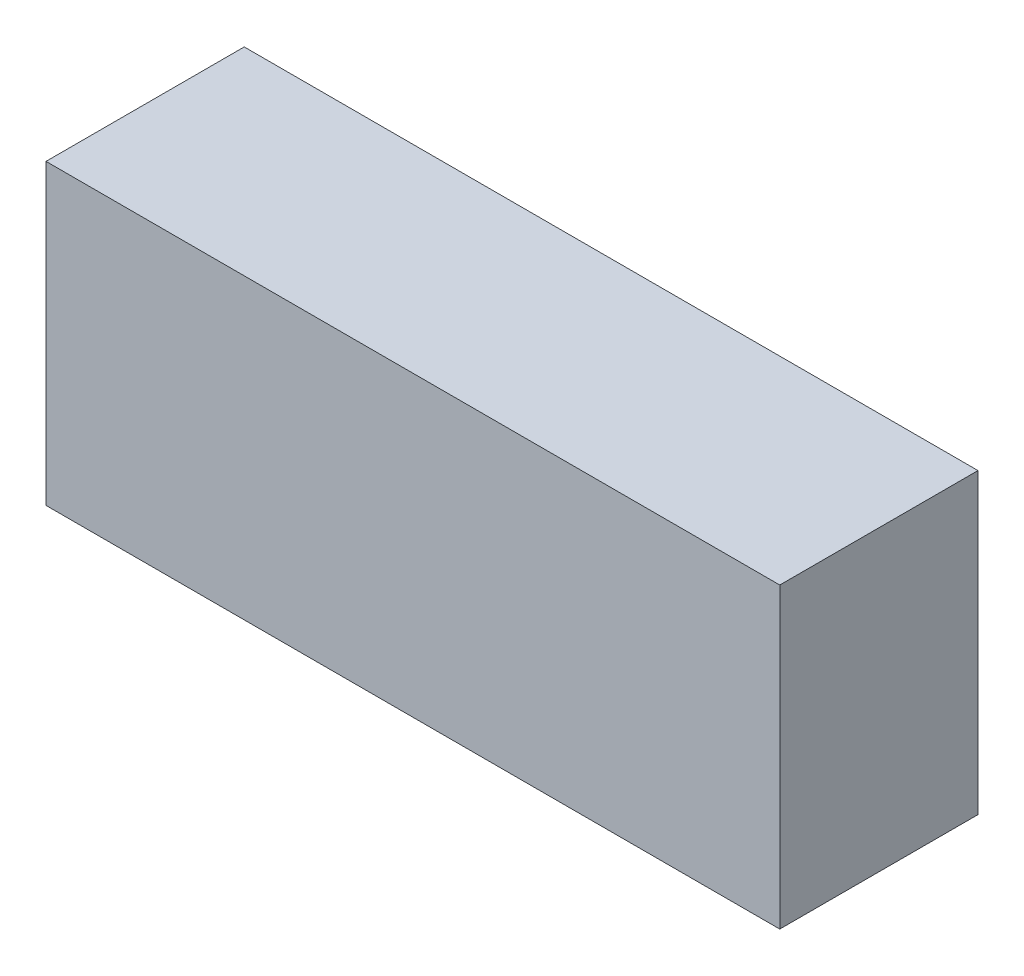
ISO-10303-21;
HEADER;
FILE_DESCRIPTION(('STEP AP214'),'2;1');
FILE_NAME('part.step','',(''),(''),'','','');
FILE_SCHEMA(('AUTOMOTIVE_DESIGN { 1 0 10303 214 1 1 1 1 }'));
ENDSEC;
DATA;
#1=APPLICATION_CONTEXT('core data for automotive mechanical design processes');
#2=APPLICATION_PROTOCOL_DEFINITION('international standard','automotive_design',2000,#1);
#3=PRODUCT_CONTEXT('',#1,'mechanical');
#4=PRODUCT('Part','Part','',(#3));
#5=PRODUCT_RELATED_PRODUCT_CATEGORY('part','',(#4));
#6=PRODUCT_DEFINITION_FORMATION('','',#4);
#7=PRODUCT_DEFINITION_CONTEXT('part definition',#1,'design');
#8=PRODUCT_DEFINITION('design','',#6,#7);
#9=PRODUCT_DEFINITION_SHAPE('','',#8);
#10=(LENGTH_UNIT() NAMED_UNIT(*) SI_UNIT(.MILLI.,.METRE.));
#11=(NAMED_UNIT(*) PLANE_ANGLE_UNIT() SI_UNIT($,.RADIAN.));
#12=(NAMED_UNIT(*) SI_UNIT($,.STERADIAN.) SOLID_ANGLE_UNIT());
#13=UNCERTAINTY_MEASURE_WITH_UNIT(LENGTH_MEASURE(1.E-05),#10,'distance_accuracy_value','');
#14=(GEOMETRIC_REPRESENTATION_CONTEXT(3) GLOBAL_UNCERTAINTY_ASSIGNED_CONTEXT((#13)) GLOBAL_UNIT_ASSIGNED_CONTEXT((#10,
#11,#12)) REPRESENTATION_CONTEXT('',''));
#15=CARTESIAN_POINT('',(0.,0.,0.));
#16=DIRECTION('',(0.,0.,1.));
#17=DIRECTION('',(1.,0.,0.));
#18=AXIS2_PLACEMENT_3D('',#15,#16,#17);
#19=CARTESIAN_POINT('',(0.,0.,1.));
#20=DIRECTION('',(0.,0.,1.));
#21=DIRECTION('',(1.,0.,0.));
#22=AXIS2_PLACEMENT_3D('',#19,#20,#21);
#23=PLANE('',#22);
#24=DIRECTION('',(1.,0.,0.));
#25=VECTOR('',#24,1.);
#26=CARTESIAN_POINT('',(1.9016,0.7516,1.));
#27=LINE('',#26,#25);
#28=CARTESIAN_POINT('',(-1.8,0.7516,1.));
#29=VERTEX_POINT('',#28);
#30=CARTESIAN_POINT('',(1.9016,0.7516,1.));
#31=VERTEX_POINT('',#30);
#32=EDGE_CURVE('E67',#29,#31,#27,.T.);
#33=ORIENTED_EDGE('',*,*,#32,.F.);
#34=DIRECTION('',(0.,1.,0.));
#35=VECTOR('',#34,1.);
#36=CARTESIAN_POINT('',(-1.8,0.7516,1.));
#37=LINE('',#36,#35);
#38=CARTESIAN_POINT('',(-1.8,-0.7516,1.));
#39=VERTEX_POINT('',#38);
#40=EDGE_CURVE('E19',#39,#29,#37,.T.);
#41=ORIENTED_EDGE('',*,*,#40,.F.);
#42=DIRECTION('',(1.,0.,0.));
#43=VECTOR('',#42,1.);
#44=CARTESIAN_POINT('',(-1.8,-0.7516,1.));
#45=LINE('',#44,#43);
#46=CARTESIAN_POINT('',(1.9016,-0.7516,1.));
#47=VERTEX_POINT('',#46);
#48=EDGE_CURVE('E57',#47,#39,#45,.F.);
#49=ORIENTED_EDGE('',*,*,#48,.F.);
#50=DIRECTION('',(0.,1.,0.));
#51=VECTOR('',#50,1.);
#52=CARTESIAN_POINT('',(1.9016,-0.7516,1.));
#53=LINE('',#52,#51);
#54=EDGE_CURVE('E52',#31,#47,#53,.F.);
#55=ORIENTED_EDGE('',*,*,#54,.F.);
#56=EDGE_LOOP('',(#33,#41,#49,#55));
#57=FACE_BOUND('',#56,.T.);
#58=ADVANCED_FACE('F16',(#57),#23,.T.);
#59=CARTESIAN_POINT('',(-1.8,0.7516,0.));
#60=DIRECTION('',(-1.,0.,0.));
#61=DIRECTION('',(0.,0.,1.));
#62=AXIS2_PLACEMENT_3D('',#59,#60,#61);
#63=PLANE('',#62);
#64=DIRECTION('',(0.,0.,1.));
#65=VECTOR('',#64,1.);
#66=CARTESIAN_POINT('',(-1.8,0.7516,0.));
#67=LINE('',#66,#65);
#68=CARTESIAN_POINT('',(-1.8,0.7516,0.));
#69=VERTEX_POINT('',#68);
#70=EDGE_CURVE('E78',#69,#29,#67,.T.);
#71=ORIENTED_EDGE('',*,*,#70,.F.);
#72=DIRECTION('',(0.,1.,0.));
#73=VECTOR('',#72,1.);
#74=CARTESIAN_POINT('',(-1.8,0.,0.));
#75=LINE('',#74,#73);
#76=CARTESIAN_POINT('',(-1.8,-0.7516,0.));
#77=VERTEX_POINT('',#76);
#78=EDGE_CURVE('E73',#69,#77,#75,.F.);
#79=ORIENTED_EDGE('',*,*,#78,.T.);
#80=DIRECTION('',(0.,0.,-1.));
#81=VECTOR('',#80,1.);
#82=CARTESIAN_POINT('',(-1.8,-0.7516,0.));
#83=LINE('',#82,#81);
#84=EDGE_CURVE('E62',#39,#77,#83,.T.);
#85=ORIENTED_EDGE('',*,*,#84,.F.);
#86=ORIENTED_EDGE('',*,*,#40,.T.);
#87=EDGE_LOOP('',(#71,#79,#85,#86));
#88=FACE_BOUND('',#87,.T.);
#89=ADVANCED_FACE('F72',(#88),#63,.T.);
#90=CARTESIAN_POINT('',(-1.8,-0.7516,0.));
#91=DIRECTION('',(0.,-1.,0.));
#92=DIRECTION('',(0.,0.,-1.));
#93=AXIS2_PLACEMENT_3D('',#90,#91,#92);
#94=PLANE('',#93);
#95=ORIENTED_EDGE('',*,*,#84,.T.);
#96=DIRECTION('',(1.,0.,0.));
#97=VECTOR('',#96,1.);
#98=CARTESIAN_POINT('',(0.,-0.7516,0.));
#99=LINE('',#98,#97);
#100=CARTESIAN_POINT('',(1.9016,-0.7516,0.));
#101=VERTEX_POINT('',#100);
#102=EDGE_CURVE('E83',#77,#101,#99,.T.);
#103=ORIENTED_EDGE('',*,*,#102,.T.);
#104=DIRECTION('',(0.,0.,-1.));
#105=VECTOR('',#104,1.);
#106=CARTESIAN_POINT('',(1.9016,-0.7516,0.));
#107=LINE('',#106,#105);
#108=EDGE_CURVE('E64',#47,#101,#107,.T.);
#109=ORIENTED_EDGE('',*,*,#108,.F.);
#110=ORIENTED_EDGE('',*,*,#48,.T.);
#111=EDGE_LOOP('',(#95,#103,#109,#110));
#112=FACE_BOUND('',#111,.T.);
#113=ADVANCED_FACE('F59',(#112),#94,.T.);
#114=CARTESIAN_POINT('',(1.9016,-0.7516,0.));
#115=DIRECTION('',(1.,0.,0.));
#116=DIRECTION('',(0.,0.,-1.));
#117=AXIS2_PLACEMENT_3D('',#114,#115,#116);
#118=PLANE('',#117);
#119=ORIENTED_EDGE('',*,*,#108,.T.);
#120=DIRECTION('',(0.,1.,0.));
#121=VECTOR('',#120,1.);
#122=CARTESIAN_POINT('',(1.9016,0.,0.));
#123=LINE('',#122,#121);
#124=CARTESIAN_POINT('',(1.9016,0.7516,0.));
#125=VERTEX_POINT('',#124);
#126=EDGE_CURVE('E25',#101,#125,#123,.T.);
#127=ORIENTED_EDGE('',*,*,#126,.T.);
#128=DIRECTION('',(0.,0.,1.));
#129=VECTOR('',#128,1.);
#130=CARTESIAN_POINT('',(1.9016,0.7516,0.));
#131=LINE('',#130,#129);
#132=EDGE_CURVE('E33',#31,#125,#131,.F.);
#133=ORIENTED_EDGE('',*,*,#132,.F.);
#134=ORIENTED_EDGE('',*,*,#54,.T.);
#135=EDGE_LOOP('',(#119,#127,#133,#134));
#136=FACE_BOUND('',#135,.T.);
#137=ADVANCED_FACE('F87',(#136),#118,.T.);
#138=CARTESIAN_POINT('',(1.9016,0.7516,0.));
#139=DIRECTION('',(0.,1.,0.));
#140=DIRECTION('',(0.,0.,1.));
#141=AXIS2_PLACEMENT_3D('',#138,#139,#140);
#142=PLANE('',#141);
#143=ORIENTED_EDGE('',*,*,#132,.T.);
#144=DIRECTION('',(1.,0.,0.));
#145=VECTOR('',#144,1.);
#146=CARTESIAN_POINT('',(0.,0.7516,0.));
#147=LINE('',#146,#145);
#148=EDGE_CURVE('E10',#125,#69,#147,.F.);
#149=ORIENTED_EDGE('',*,*,#148,.T.);
#150=ORIENTED_EDGE('',*,*,#70,.T.);
#151=ORIENTED_EDGE('',*,*,#32,.T.);
#152=EDGE_LOOP('',(#143,#149,#150,#151));
#153=FACE_BOUND('',#152,.T.);
#154=ADVANCED_FACE('F90',(#153),#142,.T.);
#155=CARTESIAN_POINT('',(0.,0.,0.));
#156=DIRECTION('',(0.,0.,1.));
#157=DIRECTION('',(1.,0.,0.));
#158=AXIS2_PLACEMENT_3D('',#155,#156,#157);
#159=PLANE('',#158);
#160=ORIENTED_EDGE('',*,*,#126,.F.);
#161=ORIENTED_EDGE('',*,*,#102,.F.);
#162=ORIENTED_EDGE('',*,*,#78,.F.);
#163=ORIENTED_EDGE('',*,*,#148,.F.);
#164=EDGE_LOOP('',(#160,#161,#162,#163));
#165=FACE_BOUND('',#164,.T.);
#166=ADVANCED_FACE('F89',(#165),#159,.F.);
#167=CLOSED_SHELL('',(#58,#89,#113,#137,#154,#166));
#168=MANIFOLD_SOLID_BREP('B1',#167);
#169=ADVANCED_BREP_SHAPE_REPRESENTATION('',(#18,#168),#14);
#170=SHAPE_DEFINITION_REPRESENTATION(#9,#169);
ENDSEC;
END-ISO-10303-21;
